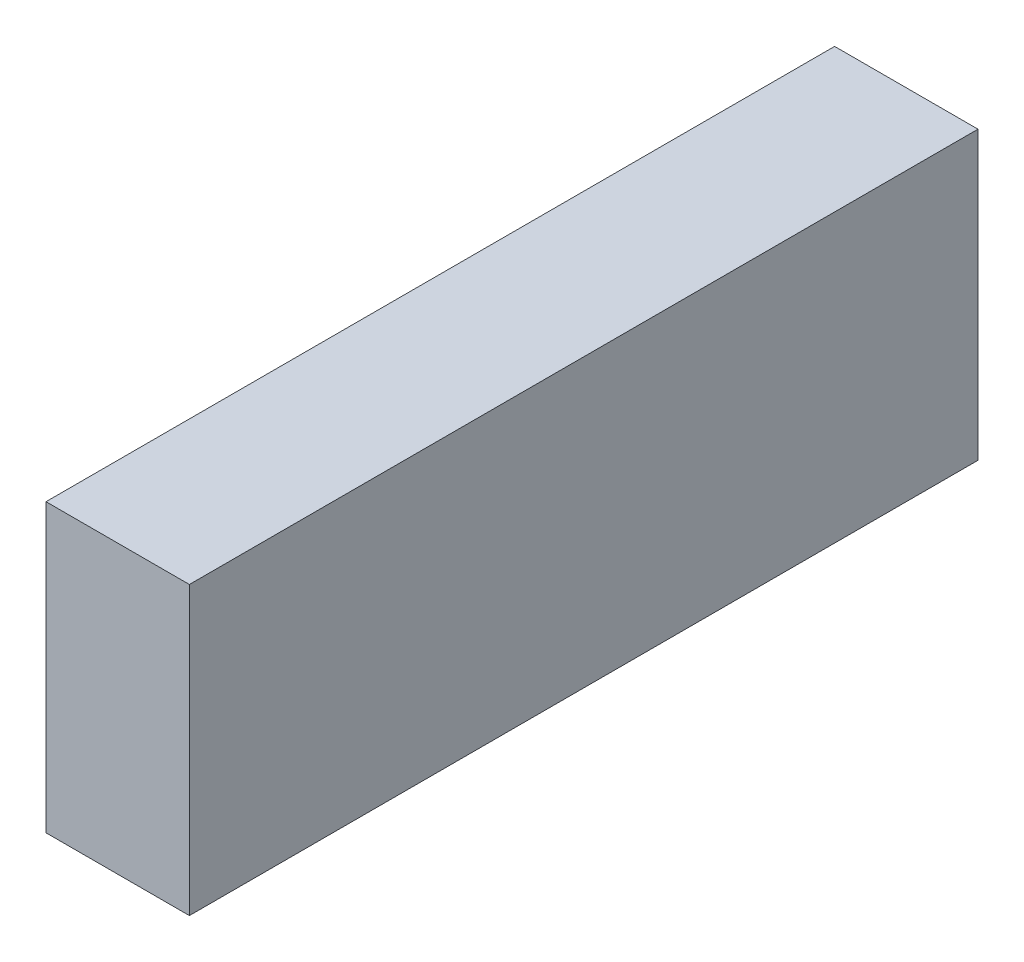
ISO-10303-21;
HEADER;
FILE_DESCRIPTION(('STEP AP214'),'2;1');
FILE_NAME('part.step','',(''),(''),'','','');
FILE_SCHEMA(('AUTOMOTIVE_DESIGN { 1 0 10303 214 1 1 1 1 }'));
ENDSEC;
DATA;
#1=APPLICATION_CONTEXT('core data for automotive mechanical design processes');
#2=APPLICATION_PROTOCOL_DEFINITION('international standard','automotive_design',2000,#1);
#3=PRODUCT_CONTEXT('',#1,'mechanical');
#4=PRODUCT('Part','Part','',(#3));
#5=PRODUCT_RELATED_PRODUCT_CATEGORY('part','',(#4));
#6=PRODUCT_DEFINITION_FORMATION('','',#4);
#7=PRODUCT_DEFINITION_CONTEXT('part definition',#1,'design');
#8=PRODUCT_DEFINITION('design','',#6,#7);
#9=PRODUCT_DEFINITION_SHAPE('','',#8);
#10=(LENGTH_UNIT() NAMED_UNIT(*) SI_UNIT(.MILLI.,.METRE.));
#11=(NAMED_UNIT(*) PLANE_ANGLE_UNIT() SI_UNIT($,.RADIAN.));
#12=(NAMED_UNIT(*) SI_UNIT($,.STERADIAN.) SOLID_ANGLE_UNIT());
#13=UNCERTAINTY_MEASURE_WITH_UNIT(LENGTH_MEASURE(1.E-05),#10,'distance_accuracy_value','');
#14=(GEOMETRIC_REPRESENTATION_CONTEXT(3) GLOBAL_UNCERTAINTY_ASSIGNED_CONTEXT((#13)) GLOBAL_UNIT_ASSIGNED_CONTEXT((#10,
#11,#12)) REPRESENTATION_CONTEXT('',''));
#15=CARTESIAN_POINT('',(0.,0.,0.));
#16=DIRECTION('',(0.,0.,1.));
#17=DIRECTION('',(1.,0.,0.));
#18=AXIS2_PLACEMENT_3D('',#15,#16,#17);
#19=CARTESIAN_POINT('',(0.,6.35,0.));
#20=DIRECTION('',(0.,-1.,0.));
#21=DIRECTION('',(0.,0.,-1.));
#22=AXIS2_PLACEMENT_3D('',#19,#20,#21);
#23=PLANE('',#22);
#24=DIRECTION('',(0.,0.,1.));
#25=VECTOR('',#24,1.);
#26=CARTESIAN_POINT('',(6.35000000000001,6.35,-63.5));
#27=LINE('',#26,#25);
#28=CARTESIAN_POINT('',(6.35000000000001,6.35,-63.5));
#29=VERTEX_POINT('',#28);
#30=CARTESIAN_POINT('',(6.35000000000002,6.35,63.5));
#31=VERTEX_POINT('',#30);
#32=EDGE_CURVE('E245',#29,#31,#27,.T.);
#33=ORIENTED_EDGE('',*,*,#32,.F.);
#34=DIRECTION('',(1.,0.,0.));
#35=VECTOR('',#34,1.);
#36=CARTESIAN_POINT('',(-12.7,6.35,-63.5));
#37=LINE('',#36,#35);
#38=CARTESIAN_POINT('',(-12.7,6.35,-63.5));
#39=VERTEX_POINT('',#38);
#40=EDGE_CURVE('E416',#39,#29,#37,.T.);
#41=ORIENTED_EDGE('',*,*,#40,.F.);
#42=DIRECTION('',(0.,0.,1.));
#43=VECTOR('',#42,1.);
#44=CARTESIAN_POINT('',(-12.7,6.35,69.85));
#45=LINE('',#44,#43);
#46=CARTESIAN_POINT('',(-12.7,6.35,-50.8));
#47=VERTEX_POINT('',#46);
#48=EDGE_CURVE('E434',#39,#47,#45,.T.);
#49=ORIENTED_EDGE('',*,*,#48,.T.);
#50=DIRECTION('',(-1.,0.,0.));
#51=VECTOR('',#50,1.);
#52=CARTESIAN_POINT('',(-12.7,6.35,-50.8));
#53=LINE('',#52,#51);
#54=CARTESIAN_POINT('',(-6.34999999999999,6.35,-50.8));
#55=VERTEX_POINT('',#54);
#56=EDGE_CURVE('E337',#55,#47,#53,.T.);
#57=ORIENTED_EDGE('',*,*,#56,.F.);
#58=DIRECTION('',(0.,0.,1.));
#59=VECTOR('',#58,1.);
#60=CARTESIAN_POINT('',(-6.35,6.35,-57.15));
#61=LINE('',#60,#59);
#62=CARTESIAN_POINT('',(-6.35,6.35,-57.15));
#63=VERTEX_POINT('',#62);
#64=EDGE_CURVE('E380',#63,#55,#61,.T.);
#65=ORIENTED_EDGE('',*,*,#64,.F.);
#66=DIRECTION('',(-1.,0.,0.));
#67=VECTOR('',#66,1.);
#68=CARTESIAN_POINT('',(0.,6.35,-57.15));
#69=LINE('',#68,#67);
#70=CARTESIAN_POINT('',(0.,6.35,-57.15));
#71=VERTEX_POINT('',#70);
#72=EDGE_CURVE('E376',#71,#63,#69,.T.);
#73=ORIENTED_EDGE('',*,*,#72,.F.);
#74=DIRECTION('',(0.,0.,-1.));
#75=VECTOR('',#74,1.);
#76=CARTESIAN_POINT('',(0.,6.35,-57.15));
#77=LINE('',#76,#75);
#78=CARTESIAN_POINT('',(0.,6.35,-31.75));
#79=VERTEX_POINT('',#78);
#80=EDGE_CURVE('E372',#79,#71,#77,.T.);
#81=ORIENTED_EDGE('',*,*,#80,.F.);
#82=DIRECTION('',(1.,0.,0.));
#83=VECTOR('',#82,1.);
#84=CARTESIAN_POINT('',(0.,6.35,-31.75));
#85=LINE('',#84,#83);
#86=CARTESIAN_POINT('',(-6.34999999999999,6.35,-31.75));
#87=VERTEX_POINT('',#86);
#88=EDGE_CURVE('E368',#87,#79,#85,.T.);
#89=ORIENTED_EDGE('',*,*,#88,.F.);
#90=DIRECTION('',(0.,0.,1.));
#91=VECTOR('',#90,1.);
#92=CARTESIAN_POINT('',(-6.34999999999999,6.35,-38.1));
#93=LINE('',#92,#91);
#94=CARTESIAN_POINT('',(-6.34999999999999,6.35,-38.1));
#95=VERTEX_POINT('',#94);
#96=EDGE_CURVE('E364',#95,#87,#93,.T.);
#97=ORIENTED_EDGE('',*,*,#96,.F.);
#98=DIRECTION('',(1.,0.,0.));
#99=VECTOR('',#98,1.);
#100=CARTESIAN_POINT('',(-12.7,6.35,-38.1));
#101=LINE('',#100,#99);
#102=CARTESIAN_POINT('',(-12.7,6.35,-38.1));
#103=VERTEX_POINT('',#102);
#104=EDGE_CURVE('E313',#103,#95,#101,.T.);
#105=ORIENTED_EDGE('',*,*,#104,.F.);
#106=CARTESIAN_POINT('',(-12.7,6.35,38.1));
#107=VERTEX_POINT('',#106);
#108=EDGE_CURVE('E438',#103,#107,#45,.T.);
#109=ORIENTED_EDGE('',*,*,#108,.T.);
#110=DIRECTION('',(1.,0.,0.));
#111=VECTOR('',#110,1.);
#112=CARTESIAN_POINT('',(-12.7,6.35,38.1));
#113=LINE('',#112,#111);
#114=CARTESIAN_POINT('',(-6.34999999999999,6.35,38.1));
#115=VERTEX_POINT('',#114);
#116=EDGE_CURVE('E264',#107,#115,#113,.T.);
#117=ORIENTED_EDGE('',*,*,#116,.T.);
#118=DIRECTION('',(0.,0.,-1.));
#119=VECTOR('',#118,1.);
#120=CARTESIAN_POINT('',(-6.34999999999999,6.35,38.1));
#121=LINE('',#120,#119);
#122=CARTESIAN_POINT('',(-6.34999999999999,6.35,31.75));
#123=VERTEX_POINT('',#122);
#124=EDGE_CURVE('E302',#115,#123,#121,.T.);
#125=ORIENTED_EDGE('',*,*,#124,.T.);
#126=DIRECTION('',(1.,0.,0.));
#127=VECTOR('',#126,1.);
#128=CARTESIAN_POINT('',(0.,6.35,31.75));
#129=LINE('',#128,#127);
#130=CARTESIAN_POINT('',(0.,6.35,31.75));
#131=VERTEX_POINT('',#130);
#132=EDGE_CURVE('E298',#123,#131,#129,.T.);
#133=ORIENTED_EDGE('',*,*,#132,.T.);
#134=DIRECTION('',(0.,0.,1.));
#135=VECTOR('',#134,1.);
#136=CARTESIAN_POINT('',(0.,6.35,57.15));
#137=LINE('',#136,#135);
#138=CARTESIAN_POINT('',(0.,6.35,57.15));
#139=VERTEX_POINT('',#138);
#140=EDGE_CURVE('E294',#131,#139,#137,.T.);
#141=ORIENTED_EDGE('',*,*,#140,.T.);
#142=DIRECTION('',(-1.,0.,0.));
#143=VECTOR('',#142,1.);
#144=CARTESIAN_POINT('',(0.,6.35,57.15));
#145=LINE('',#144,#143);
#146=CARTESIAN_POINT('',(-6.35,6.35,57.15));
#147=VERTEX_POINT('',#146);
#148=EDGE_CURVE('E290',#139,#147,#145,.T.);
#149=ORIENTED_EDGE('',*,*,#148,.T.);
#150=DIRECTION('',(0.,0.,-1.));
#151=VECTOR('',#150,1.);
#152=CARTESIAN_POINT('',(-6.35,6.35,57.15));
#153=LINE('',#152,#151);
#154=CARTESIAN_POINT('',(-6.34999999999999,6.35,50.8));
#155=VERTEX_POINT('',#154);
#156=EDGE_CURVE('E286',#147,#155,#153,.T.);
#157=ORIENTED_EDGE('',*,*,#156,.T.);
#158=DIRECTION('',(-1.,0.,0.));
#159=VECTOR('',#158,1.);
#160=CARTESIAN_POINT('',(-12.7,6.35,50.8));
#161=LINE('',#160,#159);
#162=CARTESIAN_POINT('',(-12.7,6.35,50.8));
#163=VERTEX_POINT('',#162);
#164=EDGE_CURVE('E250',#155,#163,#161,.T.);
#165=ORIENTED_EDGE('',*,*,#164,.T.);
#166=CARTESIAN_POINT('',(-12.7,6.35,63.5));
#167=VERTEX_POINT('',#166);
#168=EDGE_CURVE('E439',#163,#167,#45,.T.);
#169=ORIENTED_EDGE('',*,*,#168,.T.);
#170=DIRECTION('',(-1.,0.,0.));
#171=VECTOR('',#170,1.);
#172=CARTESIAN_POINT('',(-12.7,6.35,63.5));
#173=LINE('',#172,#171);
#174=EDGE_CURVE('E420',#31,#167,#173,.T.);
#175=ORIENTED_EDGE('',*,*,#174,.F.);
#176=EDGE_LOOP('',(#33,#41,#49,#57,#65,#73,#81,#89,#97,#105,#109,#117,#125,#133,#141,#149,#157,
#165,#169,#175));
#177=FACE_BOUND('',#176,.T.);
#178=ADVANCED_FACE('F45',(#177),#23,.F.);
#179=CARTESIAN_POINT('',(-12.7,44.45,63.5));
#180=DIRECTION('',(0.,0.,1.));
#181=DIRECTION('',(1.,0.,0.));
#182=AXIS2_PLACEMENT_3D('',#179,#180,#181);
#183=PLANE('',#182);
#184=DIRECTION('',(0.,-1.,0.));
#185=VECTOR('',#184,1.);
#186=CARTESIAN_POINT('',(6.35000000000002,171.60865090508,63.5));
#187=LINE('',#186,#185);
#188=CARTESIAN_POINT('',(6.35000000000002,44.45,63.5));
#189=VERTEX_POINT('',#188);
#190=EDGE_CURVE('E254',#189,#31,#187,.T.);
#191=ORIENTED_EDGE('',*,*,#190,.T.);
#192=ORIENTED_EDGE('',*,*,#174,.T.);
#193=DIRECTION('',(0.,-1.,0.));
#194=VECTOR('',#193,1.);
#195=CARTESIAN_POINT('',(-12.7,44.45,63.5));
#196=LINE('',#195,#194);
#197=CARTESIAN_POINT('',(-12.7,44.45,63.5));
#198=VERTEX_POINT('',#197);
#199=EDGE_CURVE('E390',#198,#167,#196,.T.);
#200=ORIENTED_EDGE('',*,*,#199,.F.);
#201=DIRECTION('',(-1.,0.,0.));
#202=VECTOR('',#201,1.);
#203=CARTESIAN_POINT('',(-12.7,44.45,63.5));
#204=LINE('',#203,#202);
#205=EDGE_CURVE('E428',#189,#198,#204,.T.);
#206=ORIENTED_EDGE('',*,*,#205,.F.);
#207=EDGE_LOOP('',(#191,#192,#200,#206));
#208=FACE_BOUND('',#207,.T.);
#209=ADVANCED_FACE('F481',(#208),#183,.F.);
#210=CARTESIAN_POINT('',(-12.7,44.45,-63.5));
#211=DIRECTION('',(0.,0.,-1.));
#212=DIRECTION('',(-1.,0.,0.));
#213=AXIS2_PLACEMENT_3D('',#210,#211,#212);
#214=PLANE('',#213);
#215=DIRECTION('',(0.,-1.,0.));
#216=VECTOR('',#215,1.);
#217=CARTESIAN_POINT('',(6.35000000000001,171.60865090508,-63.5));
#218=LINE('',#217,#216);
#219=CARTESIAN_POINT('',(6.35000000000001,44.45,-63.5));
#220=VERTEX_POINT('',#219);
#221=EDGE_CURVE('E251',#220,#29,#218,.T.);
#222=ORIENTED_EDGE('',*,*,#221,.F.);
#223=DIRECTION('',(1.,0.,0.));
#224=VECTOR('',#223,1.);
#225=CARTESIAN_POINT('',(-12.7,44.45,-63.5));
#226=LINE('',#225,#224);
#227=CARTESIAN_POINT('',(-12.7,44.45,-63.5));
#228=VERTEX_POINT('',#227);
#229=EDGE_CURVE('E411',#228,#220,#226,.T.);
#230=ORIENTED_EDGE('',*,*,#229,.F.);
#231=DIRECTION('',(0.,-1.,0.));
#232=VECTOR('',#231,1.);
#233=CARTESIAN_POINT('',(-12.7,44.45,-63.5));
#234=LINE('',#233,#232);
#235=EDGE_CURVE('E415',#228,#39,#234,.T.);
#236=ORIENTED_EDGE('',*,*,#235,.T.);
#237=ORIENTED_EDGE('',*,*,#40,.T.);
#238=EDGE_LOOP('',(#222,#230,#236,#237));
#239=FACE_BOUND('',#238,.T.);
#240=ADVANCED_FACE('F474',(#239),#214,.F.);
#241=CARTESIAN_POINT('',(-12.7,6.35,69.85));
#242=DIRECTION('',(1.,0.,0.));
#243=DIRECTION('',(0.,0.,-1.));
#244=AXIS2_PLACEMENT_3D('',#241,#242,#243);
#245=PLANE('',#244);
#246=DIRECTION('',(0.,1.,0.));
#247=VECTOR('',#246,1.);
#248=CARTESIAN_POINT('',(-12.7,0.,38.1));
#249=LINE('',#248,#247);
#250=CARTESIAN_POINT('',(-12.7,0.,38.1));
#251=VERTEX_POINT('',#250);
#252=EDGE_CURVE('E309',#251,#107,#249,.T.);
#253=ORIENTED_EDGE('',*,*,#252,.T.);
#254=ORIENTED_EDGE('',*,*,#108,.F.);
#255=DIRECTION('',(0.,1.,0.));
#256=VECTOR('',#255,1.);
#257=CARTESIAN_POINT('',(-12.7,0.,-38.1));
#258=LINE('',#257,#256);
#259=CARTESIAN_POINT('',(-12.7,0.,-38.1));
#260=VERTEX_POINT('',#259);
#261=EDGE_CURVE('E360',#260,#103,#258,.T.);
#262=ORIENTED_EDGE('',*,*,#261,.F.);
#263=DIRECTION('',(0.,0.,1.));
#264=VECTOR('',#263,1.);
#265=CARTESIAN_POINT('',(-12.7,0.,69.85));
#266=LINE('',#265,#264);
#267=EDGE_CURVE('E450',#260,#251,#266,.T.);
#268=ORIENTED_EDGE('',*,*,#267,.T.);
#269=EDGE_LOOP('',(#253,#254,#262,#268));
#270=FACE_BOUND('',#269,.T.);
#271=ADVANCED_FACE('F492',(#270),#245,.F.);
#272=CARTESIAN_POINT('',(0.,0.,0.));
#273=DIRECTION('',(0.,-1.,0.));
#274=DIRECTION('',(0.,0.,-1.));
#275=AXIS2_PLACEMENT_3D('',#272,#273,#274);
#276=PLANE('',#275);
#277=DIRECTION('',(-1.,0.,0.));
#278=VECTOR('',#277,1.);
#279=CARTESIAN_POINT('',(-12.7,0.,-69.85));
#280=LINE('',#279,#278);
#281=CARTESIAN_POINT('',(12.7,0.,-69.85));
#282=VERTEX_POINT('',#281);
#283=CARTESIAN_POINT('',(-12.7,0.,-69.85));
#284=VERTEX_POINT('',#283);
#285=EDGE_CURVE('E443',#282,#284,#280,.T.);
#286=ORIENTED_EDGE('',*,*,#285,.F.);
#287=DIRECTION('',(0.,0.,-1.));
#288=VECTOR('',#287,1.);
#289=CARTESIAN_POINT('',(12.7,0.,69.85));
#290=LINE('',#289,#288);
#291=CARTESIAN_POINT('',(12.7,0.,69.85));
#292=VERTEX_POINT('',#291);
#293=EDGE_CURVE('E424',#292,#282,#290,.T.);
#294=ORIENTED_EDGE('',*,*,#293,.F.);
#295=DIRECTION('',(1.,0.,0.));
#296=VECTOR('',#295,1.);
#297=CARTESIAN_POINT('',(-12.7,0.,69.85));
#298=LINE('',#297,#296);
#299=CARTESIAN_POINT('',(-12.7,0.,69.85));
#300=VERTEX_POINT('',#299);
#301=EDGE_CURVE('E449',#300,#292,#298,.T.);
#302=ORIENTED_EDGE('',*,*,#301,.F.);
#303=CARTESIAN_POINT('',(-12.7,0.,50.8));
#304=VERTEX_POINT('',#303);
#305=EDGE_CURVE('E215',#304,#300,#266,.T.);
#306=ORIENTED_EDGE('',*,*,#305,.F.);
#307=DIRECTION('',(-1.,0.,0.));
#308=VECTOR('',#307,1.);
#309=CARTESIAN_POINT('',(-12.7,0.,50.8));
#310=LINE('',#309,#308);
#311=CARTESIAN_POINT('',(-6.34999999999999,0.,50.8));
#312=VERTEX_POINT('',#311);
#313=EDGE_CURVE('E260',#312,#304,#310,.T.);
#314=ORIENTED_EDGE('',*,*,#313,.F.);
#315=DIRECTION('',(0.,0.,-1.));
#316=VECTOR('',#315,1.);
#317=CARTESIAN_POINT('',(-6.35,0.,57.15));
#318=LINE('',#317,#316);
#319=CARTESIAN_POINT('',(-6.35,0.,57.15));
#320=VERTEX_POINT('',#319);
#321=EDGE_CURVE('E263',#320,#312,#318,.T.);
#322=ORIENTED_EDGE('',*,*,#321,.F.);
#323=DIRECTION('',(-1.,0.,0.));
#324=VECTOR('',#323,1.);
#325=CARTESIAN_POINT('',(0.,0.,57.15));
#326=LINE('',#325,#324);
#327=CARTESIAN_POINT('',(0.,0.,57.15));
#328=VERTEX_POINT('',#327);
#329=EDGE_CURVE('E267',#328,#320,#326,.T.);
#330=ORIENTED_EDGE('',*,*,#329,.F.);
#331=DIRECTION('',(0.,0.,1.));
#332=VECTOR('',#331,1.);
#333=CARTESIAN_POINT('',(0.,0.,57.15));
#334=LINE('',#333,#332);
#335=CARTESIAN_POINT('',(0.,0.,31.75));
#336=VERTEX_POINT('',#335);
#337=EDGE_CURVE('E270',#336,#328,#334,.T.);
#338=ORIENTED_EDGE('',*,*,#337,.F.);
#339=DIRECTION('',(1.,0.,0.));
#340=VECTOR('',#339,1.);
#341=CARTESIAN_POINT('',(0.,0.,31.75));
#342=LINE('',#341,#340);
#343=CARTESIAN_POINT('',(-6.34999999999999,0.,31.75));
#344=VERTEX_POINT('',#343);
#345=EDGE_CURVE('E273',#344,#336,#342,.T.);
#346=ORIENTED_EDGE('',*,*,#345,.F.);
#347=DIRECTION('',(0.,0.,-1.));
#348=VECTOR('',#347,1.);
#349=CARTESIAN_POINT('',(-6.34999999999999,0.,38.1));
#350=LINE('',#349,#348);
#351=CARTESIAN_POINT('',(-6.34999999999999,0.,38.1));
#352=VERTEX_POINT('',#351);
#353=EDGE_CURVE('E276',#352,#344,#350,.T.);
#354=ORIENTED_EDGE('',*,*,#353,.F.);
#355=DIRECTION('',(1.,0.,0.));
#356=VECTOR('',#355,1.);
#357=CARTESIAN_POINT('',(-12.7,0.,38.1));
#358=LINE('',#357,#356);
#359=EDGE_CURVE('E279',#251,#352,#358,.T.);
#360=ORIENTED_EDGE('',*,*,#359,.F.);
#361=ORIENTED_EDGE('',*,*,#267,.F.);
#362=DIRECTION('',(1.,0.,0.));
#363=VECTOR('',#362,1.);
#364=CARTESIAN_POINT('',(-12.7,0.,-38.1));
#365=LINE('',#364,#363);
#366=CARTESIAN_POINT('',(-6.34999999999999,0.,-38.1));
#367=VERTEX_POINT('',#366);
#368=EDGE_CURVE('E333',#260,#367,#365,.T.);
#369=ORIENTED_EDGE('',*,*,#368,.T.);
#370=DIRECTION('',(0.,0.,1.));
#371=VECTOR('',#370,1.);
#372=CARTESIAN_POINT('',(-6.34999999999999,0.,-38.1));
#373=LINE('',#372,#371);
#374=CARTESIAN_POINT('',(-6.34999999999999,0.,-31.75));
#375=VERTEX_POINT('',#374);
#376=EDGE_CURVE('E69',#367,#375,#373,.T.);
#377=ORIENTED_EDGE('',*,*,#376,.T.);
#378=DIRECTION('',(1.,0.,0.));
#379=VECTOR('',#378,1.);
#380=CARTESIAN_POINT('',(0.,0.,-31.75));
#381=LINE('',#380,#379);
#382=CARTESIAN_POINT('',(0.,0.,-31.75));
#383=VERTEX_POINT('',#382);
#384=EDGE_CURVE('E340',#375,#383,#381,.T.);
#385=ORIENTED_EDGE('',*,*,#384,.T.);
#386=DIRECTION('',(0.,0.,-1.));
#387=VECTOR('',#386,1.);
#388=CARTESIAN_POINT('',(0.,0.,-57.15));
#389=LINE('',#388,#387);
#390=CARTESIAN_POINT('',(0.,0.,-57.15));
#391=VERTEX_POINT('',#390);
#392=EDGE_CURVE('E344',#383,#391,#389,.T.);
#393=ORIENTED_EDGE('',*,*,#392,.T.);
#394=DIRECTION('',(-1.,0.,0.));
#395=VECTOR('',#394,1.);
#396=CARTESIAN_POINT('',(0.,0.,-57.15));
#397=LINE('',#396,#395);
#398=CARTESIAN_POINT('',(-6.35,0.,-57.15));
#399=VERTEX_POINT('',#398);
#400=EDGE_CURVE('E348',#391,#399,#397,.T.);
#401=ORIENTED_EDGE('',*,*,#400,.T.);
#402=DIRECTION('',(0.,0.,1.));
#403=VECTOR('',#402,1.);
#404=CARTESIAN_POINT('',(-6.35,0.,-57.15));
#405=LINE('',#404,#403);
#406=CARTESIAN_POINT('',(-6.34999999999999,0.,-50.8));
#407=VERTEX_POINT('',#406);
#408=EDGE_CURVE('E352',#399,#407,#405,.T.);
#409=ORIENTED_EDGE('',*,*,#408,.T.);
#410=DIRECTION('',(-1.,0.,0.));
#411=VECTOR('',#410,1.);
#412=CARTESIAN_POINT('',(-12.7,0.,-50.8));
#413=LINE('',#412,#411);
#414=CARTESIAN_POINT('',(-12.7,0.,-50.8));
#415=VERTEX_POINT('',#414);
#416=EDGE_CURVE('E356',#407,#415,#413,.T.);
#417=ORIENTED_EDGE('',*,*,#416,.T.);
#418=EDGE_CURVE('E446',#284,#415,#266,.T.);
#419=ORIENTED_EDGE('',*,*,#418,.F.);
#420=EDGE_LOOP('',(#286,#294,#302,#306,#314,#322,#330,#338,#346,#354,#360,#361,#369,#377,#385,
#393,#401,#409,#417,#419));
#421=FACE_BOUND('',#420,.T.);
#422=ADVANCED_FACE('F459',(#421),#276,.T.);
#423=ORIENTED_EDGE('',*,*,#418,.T.);
#424=DIRECTION('',(0.,1.,0.));
#425=VECTOR('',#424,1.);
#426=CARTESIAN_POINT('',(-12.7,0.,-50.8));
#427=LINE('',#426,#425);
#428=EDGE_CURVE('E386',#415,#47,#427,.T.);
#429=ORIENTED_EDGE('',*,*,#428,.T.);
#430=ORIENTED_EDGE('',*,*,#48,.F.);
#431=ORIENTED_EDGE('',*,*,#235,.F.);
#432=DIRECTION('',(0.,0.,1.));
#433=VECTOR('',#432,1.);
#434=CARTESIAN_POINT('',(-12.7,44.45,-69.85));
#435=LINE('',#434,#433);
#436=EDGE_CURVE('E236',#228,#198,#435,.T.);
#437=ORIENTED_EDGE('',*,*,#436,.T.);
#438=ORIENTED_EDGE('',*,*,#199,.T.);
#439=ORIENTED_EDGE('',*,*,#168,.F.);
#440=DIRECTION('',(0.,1.,0.));
#441=VECTOR('',#440,1.);
#442=CARTESIAN_POINT('',(-12.7,0.,50.8));
#443=LINE('',#442,#441);
#444=EDGE_CURVE('E282',#304,#163,#443,.T.);
#445=ORIENTED_EDGE('',*,*,#444,.F.);
#446=ORIENTED_EDGE('',*,*,#305,.T.);
#447=DIRECTION('',(0.,-1.,0.));
#448=VECTOR('',#447,1.);
#449=CARTESIAN_POINT('',(-12.7,6.35,69.85));
#450=LINE('',#449,#448);
#451=CARTESIAN_POINT('',(-12.7,50.8,69.85));
#452=VERTEX_POINT('',#451);
#453=EDGE_CURVE('E206',#452,#300,#450,.T.);
#454=ORIENTED_EDGE('',*,*,#453,.F.);
#455=DIRECTION('',(0.,0.,1.));
#456=VECTOR('',#455,1.);
#457=CARTESIAN_POINT('',(-12.7,50.8,-69.85));
#458=LINE('',#457,#456);
#459=CARTESIAN_POINT('',(-12.7,50.8,-69.85));
#460=VERTEX_POINT('',#459);
#461=EDGE_CURVE('E212',#460,#452,#458,.T.);
#462=ORIENTED_EDGE('',*,*,#461,.F.);
#463=DIRECTION('',(0.,-1.,0.));
#464=VECTOR('',#463,1.);
#465=CARTESIAN_POINT('',(-12.7,6.35,-69.85));
#466=LINE('',#465,#464);
#467=EDGE_CURVE('E54',#460,#284,#466,.T.);
#468=ORIENTED_EDGE('',*,*,#467,.T.);
#469=EDGE_LOOP('',(#423,#429,#430,#431,#437,#438,#439,#445,#446,#454,#462,#468));
#470=FACE_BOUND('',#469,.T.);
#471=ADVANCED_FACE('F209',(#470),#245,.F.);
#472=CARTESIAN_POINT('',(12.7,6.35,69.85));
#473=DIRECTION('',(-1.,0.,0.));
#474=DIRECTION('',(0.,0.,1.));
#475=AXIS2_PLACEMENT_3D('',#472,#473,#474);
#476=PLANE('',#475);
#477=DIRECTION('',(0.,-1.,0.));
#478=VECTOR('',#477,1.);
#479=CARTESIAN_POINT('',(12.7,6.35,-69.85));
#480=LINE('',#479,#478);
#481=CARTESIAN_POINT('',(12.7,50.8,-69.85));
#482=VERTEX_POINT('',#481);
#483=EDGE_CURVE('E11',#482,#282,#480,.T.);
#484=ORIENTED_EDGE('',*,*,#483,.F.);
#485=DIRECTION('',(0.,0.,-1.));
#486=VECTOR('',#485,1.);
#487=CARTESIAN_POINT('',(12.7,50.8,-69.85));
#488=LINE('',#487,#486);
#489=CARTESIAN_POINT('',(12.7,50.8,69.85));
#490=VERTEX_POINT('',#489);
#491=EDGE_CURVE('E229',#490,#482,#488,.T.);
#492=ORIENTED_EDGE('',*,*,#491,.F.);
#493=DIRECTION('',(0.,-1.,0.));
#494=VECTOR('',#493,1.);
#495=CARTESIAN_POINT('',(12.7,6.35,69.85));
#496=LINE('',#495,#494);
#497=EDGE_CURVE('E220',#490,#292,#496,.T.);
#498=ORIENTED_EDGE('',*,*,#497,.T.);
#499=ORIENTED_EDGE('',*,*,#293,.T.);
#500=EDGE_LOOP('',(#484,#492,#498,#499));
#501=FACE_BOUND('',#500,.T.);
#502=ADVANCED_FACE('F47',(#501),#476,.F.);
#503=CARTESIAN_POINT('',(-12.7,6.35,-69.85));
#504=DIRECTION('',(0.,0.,1.));
#505=DIRECTION('',(1.,0.,0.));
#506=AXIS2_PLACEMENT_3D('',#503,#504,#505);
#507=PLANE('',#506);
#508=ORIENTED_EDGE('',*,*,#285,.T.);
#509=ORIENTED_EDGE('',*,*,#467,.F.);
#510=DIRECTION('',(-1.,0.,0.));
#511=VECTOR('',#510,1.);
#512=CARTESIAN_POINT('',(-12.7,50.8,-69.85));
#513=LINE('',#512,#511);
#514=EDGE_CURVE('E234',#482,#460,#513,.T.);
#515=ORIENTED_EDGE('',*,*,#514,.F.);
#516=ORIENTED_EDGE('',*,*,#483,.T.);
#517=EDGE_LOOP('',(#508,#509,#515,#516));
#518=FACE_BOUND('',#517,.T.);
#519=ADVANCED_FACE('F528',(#518),#507,.F.);
#520=CARTESIAN_POINT('',(-12.7,6.35,69.85));
#521=DIRECTION('',(0.,0.,-1.));
#522=DIRECTION('',(-1.,0.,0.));
#523=AXIS2_PLACEMENT_3D('',#520,#521,#522);
#524=PLANE('',#523);
#525=ORIENTED_EDGE('',*,*,#301,.T.);
#526=ORIENTED_EDGE('',*,*,#497,.F.);
#527=DIRECTION('',(1.,0.,0.));
#528=VECTOR('',#527,1.);
#529=CARTESIAN_POINT('',(-12.7,50.8,69.85));
#530=LINE('',#529,#528);
#531=EDGE_CURVE('E223',#452,#490,#530,.T.);
#532=ORIENTED_EDGE('',*,*,#531,.F.);
#533=ORIENTED_EDGE('',*,*,#453,.T.);
#534=EDGE_LOOP('',(#525,#526,#532,#533));
#535=FACE_BOUND('',#534,.T.);
#536=ADVANCED_FACE('F224',(#535),#524,.F.);
#537=CARTESIAN_POINT('',(-12.7,0.,-50.8));
#538=DIRECTION('',(0.,0.,-1.));
#539=DIRECTION('',(-1.,0.,0.));
#540=AXIS2_PLACEMENT_3D('',#537,#538,#539);
#541=PLANE('',#540);
#542=ORIENTED_EDGE('',*,*,#56,.T.);
#543=ORIENTED_EDGE('',*,*,#428,.F.);
#544=ORIENTED_EDGE('',*,*,#416,.F.);
#545=DIRECTION('',(0.,1.,0.));
#546=VECTOR('',#545,1.);
#547=CARTESIAN_POINT('',(-6.34999999999999,0.,-50.8));
#548=LINE('',#547,#546);
#549=EDGE_CURVE('E391',#407,#55,#548,.T.);
#550=ORIENTED_EDGE('',*,*,#549,.T.);
#551=EDGE_LOOP('',(#542,#543,#544,#550));
#552=FACE_BOUND('',#551,.T.);
#553=ADVANCED_FACE('F464',(#552),#541,.F.);
#554=CARTESIAN_POINT('',(-6.35,0.,-57.15));
#555=DIRECTION('',(-1.,0.,0.));
#556=DIRECTION('',(0.,0.,1.));
#557=AXIS2_PLACEMENT_3D('',#554,#555,#556);
#558=PLANE('',#557);
#559=ORIENTED_EDGE('',*,*,#64,.T.);
#560=ORIENTED_EDGE('',*,*,#549,.F.);
#561=ORIENTED_EDGE('',*,*,#408,.F.);
#562=DIRECTION('',(0.,1.,0.));
#563=VECTOR('',#562,1.);
#564=CARTESIAN_POINT('',(-6.35,0.,-57.15));
#565=LINE('',#564,#563);
#566=EDGE_CURVE('E394',#399,#63,#565,.T.);
#567=ORIENTED_EDGE('',*,*,#566,.T.);
#568=EDGE_LOOP('',(#559,#560,#561,#567));
#569=FACE_BOUND('',#568,.T.);
#570=ADVANCED_FACE('F621',(#569),#558,.F.);
#571=CARTESIAN_POINT('',(0.,0.,-57.15));
#572=DIRECTION('',(0.,0.,-1.));
#573=DIRECTION('',(-1.,0.,0.));
#574=AXIS2_PLACEMENT_3D('',#571,#572,#573);
#575=PLANE('',#574);
#576=ORIENTED_EDGE('',*,*,#72,.T.);
#577=ORIENTED_EDGE('',*,*,#566,.F.);
#578=ORIENTED_EDGE('',*,*,#400,.F.);
#579=DIRECTION('',(0.,1.,0.));
#580=VECTOR('',#579,1.);
#581=CARTESIAN_POINT('',(0.,0.,-57.15));
#582=LINE('',#581,#580);
#583=EDGE_CURVE('E397',#391,#71,#582,.T.);
#584=ORIENTED_EDGE('',*,*,#583,.T.);
#585=EDGE_LOOP('',(#576,#577,#578,#584));
#586=FACE_BOUND('',#585,.T.);
#587=ADVANCED_FACE('F624',(#586),#575,.F.);
#588=CARTESIAN_POINT('',(0.,0.,-57.15));
#589=DIRECTION('',(1.,0.,0.));
#590=DIRECTION('',(0.,0.,-1.));
#591=AXIS2_PLACEMENT_3D('',#588,#589,#590);
#592=PLANE('',#591);
#593=ORIENTED_EDGE('',*,*,#80,.T.);
#594=ORIENTED_EDGE('',*,*,#583,.F.);
#595=ORIENTED_EDGE('',*,*,#392,.F.);
#596=DIRECTION('',(0.,1.,0.));
#597=VECTOR('',#596,1.);
#598=CARTESIAN_POINT('',(0.,0.,-31.75));
#599=LINE('',#598,#597);
#600=EDGE_CURVE('E400',#383,#79,#599,.T.);
#601=ORIENTED_EDGE('',*,*,#600,.T.);
#602=EDGE_LOOP('',(#593,#594,#595,#601));
#603=FACE_BOUND('',#602,.T.);
#604=ADVANCED_FACE('F628',(#603),#592,.F.);
#605=CARTESIAN_POINT('',(0.,0.,-31.75));
#606=DIRECTION('',(0.,0.,1.));
#607=DIRECTION('',(1.,0.,0.));
#608=AXIS2_PLACEMENT_3D('',#605,#606,#607);
#609=PLANE('',#608);
#610=ORIENTED_EDGE('',*,*,#88,.T.);
#611=ORIENTED_EDGE('',*,*,#600,.F.);
#612=ORIENTED_EDGE('',*,*,#384,.F.);
#613=DIRECTION('',(0.,1.,0.));
#614=VECTOR('',#613,1.);
#615=CARTESIAN_POINT('',(-6.34999999999999,0.,-31.75));
#616=LINE('',#615,#614);
#617=EDGE_CURVE('E403',#375,#87,#616,.T.);
#618=ORIENTED_EDGE('',*,*,#617,.T.);
#619=EDGE_LOOP('',(#610,#611,#612,#618));
#620=FACE_BOUND('',#619,.T.);
#621=ADVANCED_FACE('F632',(#620),#609,.F.);
#622=CARTESIAN_POINT('',(-6.34999999999999,0.,-38.1));
#623=DIRECTION('',(-1.,0.,0.));
#624=DIRECTION('',(0.,0.,1.));
#625=AXIS2_PLACEMENT_3D('',#622,#623,#624);
#626=PLANE('',#625);
#627=ORIENTED_EDGE('',*,*,#96,.T.);
#628=ORIENTED_EDGE('',*,*,#617,.F.);
#629=ORIENTED_EDGE('',*,*,#376,.F.);
#630=DIRECTION('',(0.,1.,0.));
#631=VECTOR('',#630,1.);
#632=CARTESIAN_POINT('',(-6.34999999999999,0.,-38.1));
#633=LINE('',#632,#631);
#634=EDGE_CURVE('E406',#367,#95,#633,.T.);
#635=ORIENTED_EDGE('',*,*,#634,.T.);
#636=EDGE_LOOP('',(#627,#628,#629,#635));
#637=FACE_BOUND('',#636,.T.);
#638=ADVANCED_FACE('F636',(#637),#626,.F.);
#639=CARTESIAN_POINT('',(-12.7,0.,-38.1));
#640=DIRECTION('',(0.,0.,1.));
#641=DIRECTION('',(1.,0.,0.));
#642=AXIS2_PLACEMENT_3D('',#639,#640,#641);
#643=PLANE('',#642);
#644=ORIENTED_EDGE('',*,*,#104,.T.);
#645=ORIENTED_EDGE('',*,*,#634,.F.);
#646=ORIENTED_EDGE('',*,*,#368,.F.);
#647=ORIENTED_EDGE('',*,*,#261,.T.);
#648=EDGE_LOOP('',(#644,#645,#646,#647));
#649=FACE_BOUND('',#648,.T.);
#650=ADVANCED_FACE('F606',(#649),#643,.F.);
#651=CARTESIAN_POINT('',(-12.7,0.,38.1));
#652=DIRECTION('',(0.,0.,1.));
#653=DIRECTION('',(1.,0.,0.));
#654=AXIS2_PLACEMENT_3D('',#651,#652,#653);
#655=PLANE('',#654);
#656=ORIENTED_EDGE('',*,*,#116,.F.);
#657=ORIENTED_EDGE('',*,*,#252,.F.);
#658=ORIENTED_EDGE('',*,*,#359,.T.);
#659=DIRECTION('',(0.,1.,0.));
#660=VECTOR('',#659,1.);
#661=CARTESIAN_POINT('',(-6.34999999999999,0.,38.1));
#662=LINE('',#661,#660);
#663=EDGE_CURVE('E314',#352,#115,#662,.T.);
#664=ORIENTED_EDGE('',*,*,#663,.T.);
#665=EDGE_LOOP('',(#656,#657,#658,#664));
#666=FACE_BOUND('',#665,.T.);
#667=ADVANCED_FACE('F497',(#666),#655,.T.);
#668=CARTESIAN_POINT('',(-6.34999999999999,0.,38.1));
#669=DIRECTION('',(1.,0.,0.));
#670=DIRECTION('',(0.,0.,-1.));
#671=AXIS2_PLACEMENT_3D('',#668,#669,#670);
#672=PLANE('',#671);
#673=ORIENTED_EDGE('',*,*,#124,.F.);
#674=ORIENTED_EDGE('',*,*,#663,.F.);
#675=ORIENTED_EDGE('',*,*,#353,.T.);
#676=DIRECTION('',(0.,1.,0.));
#677=VECTOR('',#676,1.);
#678=CARTESIAN_POINT('',(-6.34999999999999,0.,31.75));
#679=LINE('',#678,#677);
#680=EDGE_CURVE('E317',#344,#123,#679,.T.);
#681=ORIENTED_EDGE('',*,*,#680,.T.);
#682=EDGE_LOOP('',(#673,#674,#675,#681));
#683=FACE_BOUND('',#682,.T.);
#684=ADVANCED_FACE('F505',(#683),#672,.T.);
#685=CARTESIAN_POINT('',(0.,0.,31.75));
#686=DIRECTION('',(0.,0.,1.));
#687=DIRECTION('',(1.,0.,0.));
#688=AXIS2_PLACEMENT_3D('',#685,#686,#687);
#689=PLANE('',#688);
#690=ORIENTED_EDGE('',*,*,#132,.F.);
#691=ORIENTED_EDGE('',*,*,#680,.F.);
#692=ORIENTED_EDGE('',*,*,#345,.T.);
#693=DIRECTION('',(0.,1.,0.));
#694=VECTOR('',#693,1.);
#695=CARTESIAN_POINT('',(0.,0.,31.75));
#696=LINE('',#695,#694);
#697=EDGE_CURVE('E320',#336,#131,#696,.T.);
#698=ORIENTED_EDGE('',*,*,#697,.T.);
#699=EDGE_LOOP('',(#690,#691,#692,#698));
#700=FACE_BOUND('',#699,.T.);
#701=ADVANCED_FACE('F508',(#700),#689,.T.);
#702=CARTESIAN_POINT('',(0.,0.,57.15));
#703=DIRECTION('',(-1.,0.,0.));
#704=DIRECTION('',(0.,0.,1.));
#705=AXIS2_PLACEMENT_3D('',#702,#703,#704);
#706=PLANE('',#705);
#707=ORIENTED_EDGE('',*,*,#140,.F.);
#708=ORIENTED_EDGE('',*,*,#697,.F.);
#709=ORIENTED_EDGE('',*,*,#337,.T.);
#710=DIRECTION('',(0.,1.,0.));
#711=VECTOR('',#710,1.);
#712=CARTESIAN_POINT('',(0.,0.,57.15));
#713=LINE('',#712,#711);
#714=EDGE_CURVE('E323',#328,#139,#713,.T.);
#715=ORIENTED_EDGE('',*,*,#714,.T.);
#716=EDGE_LOOP('',(#707,#708,#709,#715));
#717=FACE_BOUND('',#716,.T.);
#718=ADVANCED_FACE('F513',(#717),#706,.T.);
#719=CARTESIAN_POINT('',(0.,0.,57.15));
#720=DIRECTION('',(0.,0.,-1.));
#721=DIRECTION('',(-1.,0.,0.));
#722=AXIS2_PLACEMENT_3D('',#719,#720,#721);
#723=PLANE('',#722);
#724=ORIENTED_EDGE('',*,*,#148,.F.);
#725=ORIENTED_EDGE('',*,*,#714,.F.);
#726=ORIENTED_EDGE('',*,*,#329,.T.);
#727=DIRECTION('',(0.,1.,0.));
#728=VECTOR('',#727,1.);
#729=CARTESIAN_POINT('',(-6.35,0.,57.15));
#730=LINE('',#729,#728);
#731=EDGE_CURVE('E326',#320,#147,#730,.T.);
#732=ORIENTED_EDGE('',*,*,#731,.T.);
#733=EDGE_LOOP('',(#724,#725,#726,#732));
#734=FACE_BOUND('',#733,.T.);
#735=ADVANCED_FACE('F517',(#734),#723,.T.);
#736=CARTESIAN_POINT('',(-6.35,0.,57.15));
#737=DIRECTION('',(1.,0.,0.));
#738=DIRECTION('',(0.,0.,-1.));
#739=AXIS2_PLACEMENT_3D('',#736,#737,#738);
#740=PLANE('',#739);
#741=ORIENTED_EDGE('',*,*,#156,.F.);
#742=ORIENTED_EDGE('',*,*,#731,.F.);
#743=ORIENTED_EDGE('',*,*,#321,.T.);
#744=DIRECTION('',(0.,1.,0.));
#745=VECTOR('',#744,1.);
#746=CARTESIAN_POINT('',(-6.34999999999999,0.,50.8));
#747=LINE('',#746,#745);
#748=EDGE_CURVE('E61',#312,#155,#747,.T.);
#749=ORIENTED_EDGE('',*,*,#748,.T.);
#750=EDGE_LOOP('',(#741,#742,#743,#749));
#751=FACE_BOUND('',#750,.T.);
#752=ADVANCED_FACE('F522',(#751),#740,.T.);
#753=CARTESIAN_POINT('',(-12.7,0.,50.8));
#754=DIRECTION('',(0.,0.,-1.));
#755=DIRECTION('',(-1.,0.,0.));
#756=AXIS2_PLACEMENT_3D('',#753,#754,#755);
#757=PLANE('',#756);
#758=ORIENTED_EDGE('',*,*,#164,.F.);
#759=ORIENTED_EDGE('',*,*,#748,.F.);
#760=ORIENTED_EDGE('',*,*,#313,.T.);
#761=ORIENTED_EDGE('',*,*,#444,.T.);
#762=EDGE_LOOP('',(#758,#759,#760,#761));
#763=FACE_BOUND('',#762,.T.);
#764=ADVANCED_FACE('F523',(#763),#757,.T.);
#765=CARTESIAN_POINT('',(6.35000000000001,171.60865090508,-63.5));
#766=DIRECTION('',(1.,0.,0.));
#767=DIRECTION('',(0.,0.,-1.));
#768=AXIS2_PLACEMENT_3D('',#765,#766,#767);
#769=PLANE('',#768);
#770=ORIENTED_EDGE('',*,*,#190,.F.);
#771=DIRECTION('',(0.,0.,-1.));
#772=VECTOR('',#771,1.);
#773=CARTESIAN_POINT('',(6.35000000000001,44.45,-63.5));
#774=LINE('',#773,#772);
#775=EDGE_CURVE('E247',#189,#220,#774,.T.);
#776=ORIENTED_EDGE('',*,*,#775,.T.);
#777=ORIENTED_EDGE('',*,*,#221,.T.);
#778=ORIENTED_EDGE('',*,*,#32,.T.);
#779=EDGE_LOOP('',(#770,#776,#777,#778));
#780=FACE_BOUND('',#779,.T.);
#781=ADVANCED_FACE('F590',(#780),#769,.F.);
#782=CARTESIAN_POINT('',(0.,44.45,0.));
#783=DIRECTION('',(0.,1.,0.));
#784=DIRECTION('',(0.,0.,1.));
#785=AXIS2_PLACEMENT_3D('',#782,#783,#784);
#786=PLANE('',#785);
#787=ORIENTED_EDGE('',*,*,#436,.F.);
#788=ORIENTED_EDGE('',*,*,#229,.T.);
#789=ORIENTED_EDGE('',*,*,#775,.F.);
#790=ORIENTED_EDGE('',*,*,#205,.T.);
#791=EDGE_LOOP('',(#787,#788,#789,#790));
#792=FACE_BOUND('',#791,.T.);
#793=ADVANCED_FACE('F477',(#792),#786,.F.);
#794=CARTESIAN_POINT('',(0.,50.8,0.));
#795=DIRECTION('',(0.,1.,0.));
#796=DIRECTION('',(0.,0.,1.));
#797=AXIS2_PLACEMENT_3D('',#794,#795,#796);
#798=PLANE('',#797);
#799=ORIENTED_EDGE('',*,*,#461,.T.);
#800=ORIENTED_EDGE('',*,*,#531,.T.);
#801=ORIENTED_EDGE('',*,*,#491,.T.);
#802=ORIENTED_EDGE('',*,*,#514,.T.);
#803=EDGE_LOOP('',(#799,#800,#801,#802));
#804=FACE_BOUND('',#803,.T.);
#805=ADVANCED_FACE('F232',(#804),#798,.T.);
#806=CLOSED_SHELL('',(#178,#209,#240,#271,#422,#471,#502,#519,#536,#553,#570,#587,#604,#621,
#638,#650,#667,#684,#701,#718,#735,#752,#764,#781,#793,#805));
#807=MANIFOLD_SOLID_BREP('B2',#806);
#808=ADVANCED_BREP_SHAPE_REPRESENTATION('',(#18,#807),#14);
#809=SHAPE_DEFINITION_REPRESENTATION(#9,#808);
ENDSEC;
END-ISO-10303-21;
